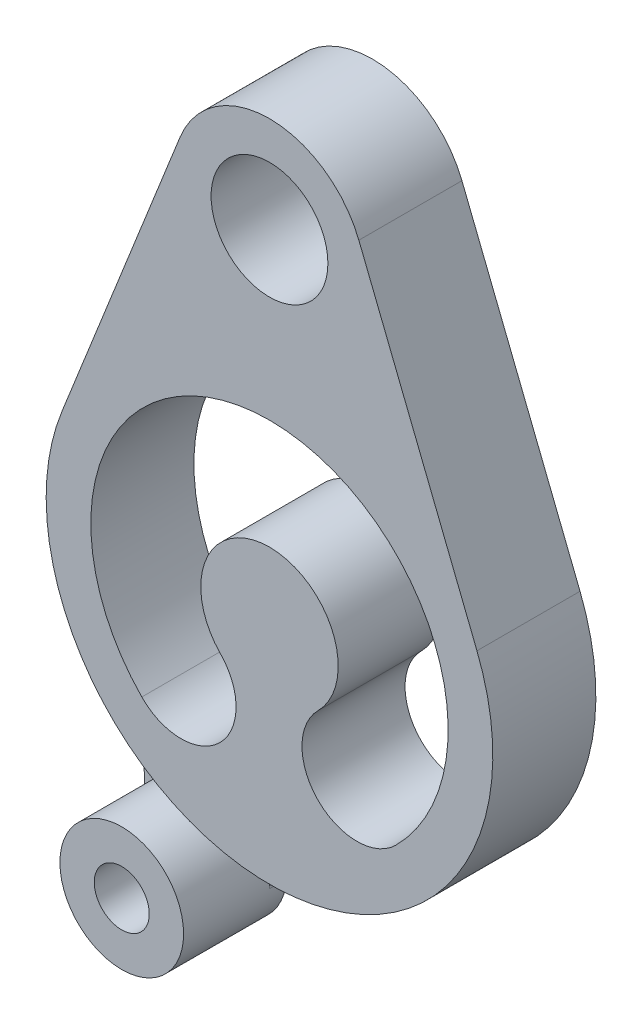
ISO-10303-21;
HEADER;
FILE_DESCRIPTION(('STEP AP214'),'2;1');
FILE_NAME('part.step','',(''),(''),'','','');
FILE_SCHEMA(('AUTOMOTIVE_DESIGN { 1 0 10303 214 1 1 1 1 }'));
ENDSEC;
DATA;
#1=APPLICATION_CONTEXT('core data for automotive mechanical design processes');
#2=APPLICATION_PROTOCOL_DEFINITION('international standard','automotive_design',2000,#1);
#3=PRODUCT_CONTEXT('',#1,'mechanical');
#4=PRODUCT('Part','Part','',(#3));
#5=PRODUCT_RELATED_PRODUCT_CATEGORY('part','',(#4));
#6=PRODUCT_DEFINITION_FORMATION('','',#4);
#7=PRODUCT_DEFINITION_CONTEXT('part definition',#1,'design');
#8=PRODUCT_DEFINITION('design','',#6,#7);
#9=PRODUCT_DEFINITION_SHAPE('','',#8);
#10=(LENGTH_UNIT() NAMED_UNIT(*) SI_UNIT(.MILLI.,.METRE.));
#11=(NAMED_UNIT(*) PLANE_ANGLE_UNIT() SI_UNIT($,.RADIAN.));
#12=(NAMED_UNIT(*) SI_UNIT($,.STERADIAN.) SOLID_ANGLE_UNIT());
#13=UNCERTAINTY_MEASURE_WITH_UNIT(LENGTH_MEASURE(1.E-05),#10,'distance_accuracy_value','');
#14=(GEOMETRIC_REPRESENTATION_CONTEXT(3) GLOBAL_UNCERTAINTY_ASSIGNED_CONTEXT((#13)) GLOBAL_UNIT_ASSIGNED_CONTEXT((#10,
#11,#12)) REPRESENTATION_CONTEXT('',''));
#15=CARTESIAN_POINT('',(0.,0.,0.));
#16=DIRECTION('',(0.,0.,1.));
#17=DIRECTION('',(1.,0.,0.));
#18=AXIS2_PLACEMENT_3D('',#15,#16,#17);
#19=CARTESIAN_POINT('',(26.0128891128994,10.36,30.));
#20=DIRECTION('',(0.929031754032121,0.37,0.));
#21=DIRECTION('',(-0.37,0.929031754032122,0.));
#22=AXIS2_PLACEMENT_3D('',#19,#20,#21);
#23=PLANE('',#22);
#24=DIRECTION('',(0.37,-0.929031754032122,0.));
#25=VECTOR('',#24,1.);
#26=CARTESIAN_POINT('',(26.0128891128994,10.36,0.));
#27=LINE('',#26,#25);
#28=CARTESIAN_POINT('',(26.0128891128994,10.36,0.));
#29=VERTEX_POINT('',#28);
#30=CARTESIAN_POINT('',(60.3870640120879,-75.95,0.));
#31=VERTEX_POINT('',#30);
#32=EDGE_CURVE('E215',#29,#31,#27,.T.);
#33=ORIENTED_EDGE('',*,*,#32,.F.);
#34=DIRECTION('',(0.,0.,-1.));
#35=VECTOR('',#34,1.);
#36=CARTESIAN_POINT('',(26.0128891128994,10.36,30.));
#37=LINE('',#36,#35);
#38=CARTESIAN_POINT('',(26.0128891128994,10.36,30.));
#39=VERTEX_POINT('',#38);
#40=EDGE_CURVE('E11',#39,#29,#37,.T.);
#41=ORIENTED_EDGE('',*,*,#40,.F.);
#42=DIRECTION('',(0.37,-0.929031754032122,0.));
#43=VECTOR('',#42,1.);
#44=CARTESIAN_POINT('',(26.0128891128994,10.36,30.));
#45=LINE('',#44,#43);
#46=CARTESIAN_POINT('',(60.3870640120879,-75.95,30.));
#47=VERTEX_POINT('',#46);
#48=EDGE_CURVE('E185',#39,#47,#45,.T.);
#49=ORIENTED_EDGE('',*,*,#48,.T.);
#50=DIRECTION('',(0.,0.,-1.));
#51=VECTOR('',#50,1.);
#52=CARTESIAN_POINT('',(60.3870640120879,-75.95,30.));
#53=LINE('',#52,#51);
#54=EDGE_CURVE('E229',#47,#31,#53,.T.);
#55=ORIENTED_EDGE('',*,*,#54,.T.);
#56=EDGE_LOOP('',(#33,#41,#49,#55));
#57=FACE_BOUND('',#56,.T.);
#58=ADVANCED_FACE('F34',(#57),#23,.T.);
#59=CARTESIAN_POINT('',(0.,0.,30.));
#60=DIRECTION('',(0.,0.,-1.));
#61=DIRECTION('',(-1.,0.,0.));
#62=AXIS2_PLACEMENT_3D('',#59,#60,#61);
#63=CYLINDRICAL_SURFACE('',#62,28.);
#64=CARTESIAN_POINT('',(0.,0.,0.));
#65=DIRECTION('',(0.,0.,1.));
#66=DIRECTION('',(1.,0.,0.));
#67=AXIS2_PLACEMENT_3D('',#64,#65,#66);
#68=CIRCLE('',#67,28.);
#69=CARTESIAN_POINT('',(-26.0128891128994,10.36,0.));
#70=VERTEX_POINT('',#69);
#71=EDGE_CURVE('E218',#29,#70,#68,.T.);
#72=ORIENTED_EDGE('',*,*,#71,.T.);
#73=DIRECTION('',(0.,0.,-1.));
#74=VECTOR('',#73,1.);
#75=CARTESIAN_POINT('',(-26.0128891128994,10.36,30.));
#76=LINE('',#75,#74);
#77=CARTESIAN_POINT('',(-26.0128891128994,10.36,30.));
#78=VERTEX_POINT('',#77);
#79=EDGE_CURVE('E43',#78,#70,#76,.T.);
#80=ORIENTED_EDGE('',*,*,#79,.F.);
#81=CARTESIAN_POINT('',(0.,0.,30.));
#82=DIRECTION('',(0.,0.,1.));
#83=DIRECTION('',(1.,0.,0.));
#84=AXIS2_PLACEMENT_3D('',#81,#82,#83);
#85=CIRCLE('',#84,28.);
#86=EDGE_CURVE('E188',#39,#78,#85,.T.);
#87=ORIENTED_EDGE('',*,*,#86,.F.);
#88=ORIENTED_EDGE('',*,*,#40,.T.);
#89=EDGE_LOOP('',(#72,#80,#87,#88));
#90=FACE_BOUND('',#89,.T.);
#91=ADVANCED_FACE('F281',(#90),#63,.T.);
#92=CARTESIAN_POINT('',(-26.0128891128994,10.36,30.));
#93=DIRECTION('',(0.929031754032121,-0.37,0.));
#94=DIRECTION('',(0.37,0.929031754032122,0.));
#95=AXIS2_PLACEMENT_3D('',#92,#93,#94);
#96=PLANE('',#95);
#97=DIRECTION('',(-0.37,-0.929031754032122,0.));
#98=VECTOR('',#97,1.);
#99=CARTESIAN_POINT('',(-26.0128891128994,10.36,0.));
#100=LINE('',#99,#98);
#101=CARTESIAN_POINT('',(-60.3870640120879,-75.95,0.));
#102=VERTEX_POINT('',#101);
#103=EDGE_CURVE('E221',#70,#102,#100,.T.);
#104=ORIENTED_EDGE('',*,*,#103,.T.);
#105=DIRECTION('',(0.,0.,-1.));
#106=VECTOR('',#105,1.);
#107=CARTESIAN_POINT('',(-60.3870640120879,-75.95,30.));
#108=LINE('',#107,#106);
#109=CARTESIAN_POINT('',(-60.3870640120879,-75.95,30.));
#110=VERTEX_POINT('',#109);
#111=EDGE_CURVE('E237',#110,#102,#108,.T.);
#112=ORIENTED_EDGE('',*,*,#111,.F.);
#113=DIRECTION('',(-0.37,-0.929031754032122,0.));
#114=VECTOR('',#113,1.);
#115=CARTESIAN_POINT('',(-26.0128891128994,10.36,30.));
#116=LINE('',#115,#114);
#117=EDGE_CURVE('E191',#78,#110,#116,.T.);
#118=ORIENTED_EDGE('',*,*,#117,.F.);
#119=ORIENTED_EDGE('',*,*,#79,.T.);
#120=EDGE_LOOP('',(#104,#112,#118,#119));
#121=FACE_BOUND('',#120,.T.);
#122=ADVANCED_FACE('F283',(#121),#96,.F.);
#123=CARTESIAN_POINT('',(0.,-100.,30.));
#124=DIRECTION('',(0.,0.,-1.));
#125=DIRECTION('',(-1.,0.,0.));
#126=AXIS2_PLACEMENT_3D('',#123,#124,#125);
#127=CYLINDRICAL_SURFACE('',#126,65.);
#128=CARTESIAN_POINT('',(0.,-100.,0.));
#129=DIRECTION('',(0.,0.,1.));
#130=DIRECTION('',(1.,0.,0.));
#131=AXIS2_PLACEMENT_3D('',#128,#129,#130);
#132=CIRCLE('',#131,65.);
#133=CARTESIAN_POINT('',(-65.,-100.,0.));
#134=VERTEX_POINT('',#133);
#135=EDGE_CURVE('E224',#102,#134,#132,.T.);
#136=ORIENTED_EDGE('',*,*,#135,.T.);
#137=DIRECTION('',(0.,0.,-1.));
#138=VECTOR('',#137,1.);
#139=CARTESIAN_POINT('',(-65.,-100.,30.));
#140=LINE('',#139,#138);
#141=CARTESIAN_POINT('',(-65.,-100.,30.));
#142=VERTEX_POINT('',#141);
#143=EDGE_CURVE('E234',#142,#134,#140,.T.);
#144=ORIENTED_EDGE('',*,*,#143,.F.);
#145=CARTESIAN_POINT('',(0.,-100.,30.));
#146=DIRECTION('',(0.,0.,1.));
#147=DIRECTION('',(1.,0.,0.));
#148=AXIS2_PLACEMENT_3D('',#145,#146,#147);
#149=CIRCLE('',#148,65.);
#150=EDGE_CURVE('E194',#110,#142,#149,.T.);
#151=ORIENTED_EDGE('',*,*,#150,.F.);
#152=ORIENTED_EDGE('',*,*,#111,.T.);
#153=EDGE_LOOP('',(#136,#144,#151,#152));
#154=FACE_BOUND('',#153,.T.);
#155=ADVANCED_FACE('F287',(#154),#127,.T.);
#156=CARTESIAN_POINT('',(-69.2892095970462,-3.06596056991683,30.));
#157=DIRECTION('',(0.999022459529505,0.0442054901072124,0.));
#158=DIRECTION('',(-0.0442054901072124,0.999022459529505,0.));
#159=AXIS2_PLACEMENT_3D('',#156,#157,#158);
#160=PLANE('',#159);
#161=DIRECTION('',(0.0442054901072124,-0.999022459529505,0.));
#162=VECTOR('',#161,1.);
#163=CARTESIAN_POINT('',(-69.2892095970462,-3.06596056991683,0.));
#164=LINE('',#163,#162);
#165=CARTESIAN_POINT('',(-64.7459637037696,-105.741096068709,0.));
#166=VERTEX_POINT('',#165);
#167=EDGE_CURVE('E227',#134,#166,#164,.T.);
#168=ORIENTED_EDGE('',*,*,#167,.T.);
#169=DIRECTION('',(0.,0.,-1.));
#170=VECTOR('',#169,1.);
#171=CARTESIAN_POINT('',(-64.7459637037696,-105.741096068709,5.));
#172=LINE('',#171,#170);
#173=CARTESIAN_POINT('',(-64.7459637037696,-105.741096068709,5.));
#174=VERTEX_POINT('',#173);
#175=EDGE_CURVE('E59',#174,#166,#172,.T.);
#176=ORIENTED_EDGE('',*,*,#175,.F.);
#177=DIRECTION('',(0.,0.,-1.));
#178=VECTOR('',#177,1.);
#179=CARTESIAN_POINT('',(-64.7459637037696,-105.741096068709,30.));
#180=LINE('',#179,#178);
#181=CARTESIAN_POINT('',(-64.7459637037696,-105.741096068709,30.));
#182=VERTEX_POINT('',#181);
#183=EDGE_CURVE('E232',#182,#174,#180,.T.);
#184=ORIENTED_EDGE('',*,*,#183,.F.);
#185=DIRECTION('',(0.0442054901072124,-0.999022459529505,0.));
#186=VECTOR('',#185,1.);
#187=CARTESIAN_POINT('',(-69.2892095970462,-3.06596056991683,30.));
#188=LINE('',#187,#186);
#189=EDGE_CURVE('E197',#142,#182,#188,.T.);
#190=ORIENTED_EDGE('',*,*,#189,.F.);
#191=ORIENTED_EDGE('',*,*,#143,.T.);
#192=EDGE_LOOP('',(#168,#176,#184,#190,#191));
#193=FACE_BOUND('',#192,.T.);
#194=ADVANCED_FACE('F288',(#193),#160,.F.);
#195=CARTESIAN_POINT('',(-25.7298452623042,-125.178861427354,30.));
#196=DIRECTION('',(0.,0.,-1.));
#197=DIRECTION('',(-1.,0.,0.));
#198=AXIS2_PLACEMENT_3D('',#195,#196,#197);
#199=CYLINDRICAL_SURFACE('',#198,16.);
#200=CARTESIAN_POINT('',(-25.7298452623042,-125.178861427354,0.));
#201=DIRECTION('',(0.,0.,1.));
#202=DIRECTION('',(1.,0.,0.));
#203=AXIS2_PLACEMENT_3D('',#200,#201,#202);
#204=CIRCLE('',#203,16.);
#205=CARTESIAN_POINT('',(-37.1653320455504,-136.369466506178,0.));
#206=VERTEX_POINT('',#205);
#207=CARTESIAN_POINT('',(-14.2943584790579,-113.98825634853,0.));
#208=VERTEX_POINT('',#207);
#209=EDGE_CURVE('E203',#206,#208,#204,.T.);
#210=ORIENTED_EDGE('',*,*,#209,.F.);
#211=DIRECTION('',(0.,0.,-1.));
#212=VECTOR('',#211,1.);
#213=CARTESIAN_POINT('',(-37.1653320455504,-136.369466506178,30.));
#214=LINE('',#213,#212);
#215=CARTESIAN_POINT('',(-37.1653320455504,-136.369466506178,30.));
#216=VERTEX_POINT('',#215);
#217=EDGE_CURVE('E38',#216,#206,#214,.T.);
#218=ORIENTED_EDGE('',*,*,#217,.F.);
#219=CARTESIAN_POINT('',(-25.7298452623042,-125.178861427354,30.));
#220=DIRECTION('',(0.,0.,1.));
#221=DIRECTION('',(1.,0.,0.));
#222=AXIS2_PLACEMENT_3D('',#219,#220,#221);
#223=CIRCLE('',#222,16.);
#224=CARTESIAN_POINT('',(-14.2943584790579,-113.98825634853,30.));
#225=VERTEX_POINT('',#224);
#226=EDGE_CURVE('E173',#216,#225,#223,.T.);
#227=ORIENTED_EDGE('',*,*,#226,.T.);
#228=DIRECTION('',(0.,0.,-1.));
#229=VECTOR('',#228,1.);
#230=CARTESIAN_POINT('',(-14.2943584790579,-113.98825634853,30.));
#231=LINE('',#230,#229);
#232=EDGE_CURVE('E242',#225,#208,#231,.T.);
#233=ORIENTED_EDGE('',*,*,#232,.T.);
#234=EDGE_LOOP('',(#210,#218,#227,#233));
#235=FACE_BOUND('',#234,.T.);
#236=ADVANCED_FACE('F255',(#235),#199,.F.);
#237=CARTESIAN_POINT('',(0.,-100.,30.));
#238=DIRECTION('',(0.,0.,-1.));
#239=DIRECTION('',(-1.,0.,0.));
#240=AXIS2_PLACEMENT_3D('',#237,#238,#239);
#241=CYLINDRICAL_SURFACE('',#240,52.);
#242=CARTESIAN_POINT('',(0.,-100.,0.));
#243=DIRECTION('',(0.,0.,1.));
#244=DIRECTION('',(1.,0.,0.));
#245=AXIS2_PLACEMENT_3D('',#242,#243,#244);
#246=CIRCLE('',#245,52.);
#247=CARTESIAN_POINT('',(36.7695526217003,-136.769552621701,0.));
#248=VERTEX_POINT('',#247);
#249=EDGE_CURVE('E206',#248,#206,#246,.T.);
#250=ORIENTED_EDGE('',*,*,#249,.F.);
#251=DIRECTION('',(0.,0.,-1.));
#252=VECTOR('',#251,1.);
#253=CARTESIAN_POINT('',(36.7695526217003,-136.769552621701,30.));
#254=LINE('',#253,#252);
#255=CARTESIAN_POINT('',(36.7695526217003,-136.769552621701,30.));
#256=VERTEX_POINT('',#255);
#257=EDGE_CURVE('E245',#256,#248,#254,.T.);
#258=ORIENTED_EDGE('',*,*,#257,.F.);
#259=CARTESIAN_POINT('',(0.,-100.,30.));
#260=DIRECTION('',(0.,0.,1.));
#261=DIRECTION('',(1.,0.,0.));
#262=AXIS2_PLACEMENT_3D('',#259,#260,#261);
#263=CIRCLE('',#262,52.);
#264=EDGE_CURVE('E177',#256,#216,#263,.T.);
#265=ORIENTED_EDGE('',*,*,#264,.T.);
#266=ORIENTED_EDGE('',*,*,#217,.T.);
#267=EDGE_LOOP('',(#250,#258,#265,#266));
#268=FACE_BOUND('',#267,.T.);
#269=ADVANCED_FACE('F251',(#268),#241,.F.);
#270=CARTESIAN_POINT('',(25.4558441227156,-125.455844122716,30.));
#271=DIRECTION('',(0.,0.,-1.));
#272=DIRECTION('',(-1.,0.,0.));
#273=AXIS2_PLACEMENT_3D('',#270,#271,#272);
#274=CYLINDRICAL_SURFACE('',#273,16.);
#275=CARTESIAN_POINT('',(25.4558441227156,-125.455844122716,0.));
#276=DIRECTION('',(0.,0.,1.));
#277=DIRECTION('',(1.,0.,0.));
#278=AXIS2_PLACEMENT_3D('',#275,#276,#277);
#279=CIRCLE('',#278,16.);
#280=CARTESIAN_POINT('',(14.1421356237309,-114.142135623731,0.));
#281=VERTEX_POINT('',#280);
#282=EDGE_CURVE('E209',#281,#248,#279,.T.);
#283=ORIENTED_EDGE('',*,*,#282,.F.);
#284=DIRECTION('',(0.,0.,-1.));
#285=VECTOR('',#284,1.);
#286=CARTESIAN_POINT('',(14.1421356237309,-114.142135623731,30.));
#287=LINE('',#286,#285);
#288=CARTESIAN_POINT('',(14.1421356237309,-114.142135623731,30.));
#289=VERTEX_POINT('',#288);
#290=EDGE_CURVE('E244',#289,#281,#287,.T.);
#291=ORIENTED_EDGE('',*,*,#290,.F.);
#292=CARTESIAN_POINT('',(25.4558441227156,-125.455844122716,30.));
#293=DIRECTION('',(0.,0.,1.));
#294=DIRECTION('',(1.,0.,0.));
#295=AXIS2_PLACEMENT_3D('',#292,#293,#294);
#296=CIRCLE('',#295,16.);
#297=EDGE_CURVE('E180',#289,#256,#296,.T.);
#298=ORIENTED_EDGE('',*,*,#297,.T.);
#299=ORIENTED_EDGE('',*,*,#257,.T.);
#300=EDGE_LOOP('',(#283,#291,#298,#299));
#301=FACE_BOUND('',#300,.T.);
#302=ADVANCED_FACE('F261',(#301),#274,.F.);
#303=CARTESIAN_POINT('',(0.,-100.,30.));
#304=DIRECTION('',(0.,0.,-1.));
#305=DIRECTION('',(-1.,0.,0.));
#306=AXIS2_PLACEMENT_3D('',#303,#304,#305);
#307=CYLINDRICAL_SURFACE('',#306,20.);
#308=CARTESIAN_POINT('',(0.,-100.,0.));
#309=DIRECTION('',(0.,0.,1.));
#310=DIRECTION('',(1.,0.,0.));
#311=AXIS2_PLACEMENT_3D('',#308,#309,#310);
#312=CIRCLE('',#311,20.);
#313=EDGE_CURVE('E212',#281,#208,#312,.T.);
#314=ORIENTED_EDGE('',*,*,#313,.T.);
#315=ORIENTED_EDGE('',*,*,#232,.F.);
#316=CARTESIAN_POINT('',(0.,-100.,30.));
#317=DIRECTION('',(0.,0.,1.));
#318=DIRECTION('',(1.,0.,0.));
#319=AXIS2_PLACEMENT_3D('',#316,#317,#318);
#320=CIRCLE('',#319,20.);
#321=EDGE_CURVE('E183',#289,#225,#320,.T.);
#322=ORIENTED_EDGE('',*,*,#321,.F.);
#323=ORIENTED_EDGE('',*,*,#290,.T.);
#324=EDGE_LOOP('',(#314,#315,#322,#323));
#325=FACE_BOUND('',#324,.T.);
#326=ADVANCED_FACE('F265',(#325),#307,.T.);
#327=CARTESIAN_POINT('',(0.,0.,30.));
#328=DIRECTION('',(0.,0.,-1.));
#329=DIRECTION('',(-1.,0.,0.));
#330=AXIS2_PLACEMENT_3D('',#327,#328,#329);
#331=CYLINDRICAL_SURFACE('',#330,17.);
#332=CARTESIAN_POINT('',(0.,0.,30.));
#333=DIRECTION('',(0.,0.,1.));
#334=DIRECTION('',(1.,0.,0.));
#335=AXIS2_PLACEMENT_3D('',#332,#333,#334);
#336=CIRCLE('',#335,17.);
#337=CARTESIAN_POINT('',(17.,0.,30.));
#338=VERTEX_POINT('',#337);
#339=EDGE_CURVE('E170',#338,#338,#336,.T.);
#340=ORIENTED_EDGE('',*,*,#339,.T.);
#341=EDGE_LOOP('',(#340));
#342=FACE_BOUND('',#341,.T.);
#343=CARTESIAN_POINT('',(0.,0.,0.));
#344=DIRECTION('',(0.,0.,1.));
#345=DIRECTION('',(1.,0.,0.));
#346=AXIS2_PLACEMENT_3D('',#343,#344,#345);
#347=CIRCLE('',#346,17.);
#348=CARTESIAN_POINT('',(17.,0.,0.));
#349=VERTEX_POINT('',#348);
#350=EDGE_CURVE('E169',#349,#349,#347,.T.);
#351=ORIENTED_EDGE('',*,*,#350,.F.);
#352=EDGE_LOOP('',(#351));
#353=FACE_BOUND('',#352,.T.);
#354=ADVANCED_FACE('F36',(#342,#353),#331,.F.);
#355=CARTESIAN_POINT('',(0.,-100.,5.));
#356=DIRECTION('',(0.,0.,1.));
#357=DIRECTION('',(1.,0.,0.));
#358=AXIS2_PLACEMENT_3D('',#355,#356,#357);
#359=CIRCLE('',#358,65.);
#360=CARTESIAN_POINT('',(2.03038556267224,-164.96828098747,5.));
#361=VERTEX_POINT('',#360);
#362=EDGE_CURVE('E51',#174,#361,#359,.T.);
#363=ORIENTED_EDGE('',*,*,#362,.T.);
#364=DIRECTION('',(0.,0.,-1.));
#365=VECTOR('',#364,1.);
#366=CARTESIAN_POINT('',(2.03038556267222,-164.96828098747,5.));
#367=LINE('',#366,#365);
#368=CARTESIAN_POINT('',(2.03038556267222,-164.96828098747,0.));
#369=VERTEX_POINT('',#368);
#370=EDGE_CURVE('E167',#361,#369,#367,.T.);
#371=ORIENTED_EDGE('',*,*,#370,.T.);
#372=EDGE_CURVE('E174',#369,#31,#132,.T.);
#373=ORIENTED_EDGE('',*,*,#372,.T.);
#374=ORIENTED_EDGE('',*,*,#54,.F.);
#375=EDGE_CURVE('E198',#182,#47,#149,.T.);
#376=ORIENTED_EDGE('',*,*,#375,.F.);
#377=ORIENTED_EDGE('',*,*,#183,.T.);
#378=EDGE_LOOP('',(#363,#371,#373,#374,#376,#377));
#379=FACE_BOUND('',#378,.T.);
#380=ADVANCED_FACE('F270',(#379),#127,.T.);
#381=CARTESIAN_POINT('',(0.,0.,30.));
#382=DIRECTION('',(0.,0.,1.));
#383=DIRECTION('',(1.,0.,0.));
#384=AXIS2_PLACEMENT_3D('',#381,#382,#383);
#385=PLANE('',#384);
#386=ORIENTED_EDGE('',*,*,#339,.F.);
#387=EDGE_LOOP('',(#386));
#388=FACE_BOUND('',#387,.T.);
#389=ORIENTED_EDGE('',*,*,#226,.F.);
#390=ORIENTED_EDGE('',*,*,#264,.F.);
#391=ORIENTED_EDGE('',*,*,#297,.F.);
#392=ORIENTED_EDGE('',*,*,#321,.T.);
#393=EDGE_LOOP('',(#389,#390,#391,#392));
#394=FACE_BOUND('',#393,.T.);
#395=ORIENTED_EDGE('',*,*,#48,.F.);
#396=ORIENTED_EDGE('',*,*,#86,.T.);
#397=ORIENTED_EDGE('',*,*,#117,.T.);
#398=ORIENTED_EDGE('',*,*,#150,.T.);
#399=ORIENTED_EDGE('',*,*,#189,.T.);
#400=ORIENTED_EDGE('',*,*,#375,.T.);
#401=EDGE_LOOP('',(#395,#396,#397,#398,#399,#400));
#402=FACE_BOUND('',#401,.T.);
#403=ADVANCED_FACE('F267',(#388,#394,#402),#385,.T.);
#404=CARTESIAN_POINT('',(0.,0.,0.));
#405=DIRECTION('',(0.,0.,1.));
#406=DIRECTION('',(1.,0.,0.));
#407=AXIS2_PLACEMENT_3D('',#404,#405,#406);
#408=PLANE('',#407);
#409=ORIENTED_EDGE('',*,*,#350,.T.);
#410=EDGE_LOOP('',(#409));
#411=FACE_BOUND('',#410,.T.);
#412=ORIENTED_EDGE('',*,*,#209,.T.);
#413=ORIENTED_EDGE('',*,*,#313,.F.);
#414=ORIENTED_EDGE('',*,*,#282,.T.);
#415=ORIENTED_EDGE('',*,*,#249,.T.);
#416=EDGE_LOOP('',(#412,#413,#414,#415));
#417=FACE_BOUND('',#416,.T.);
#418=ORIENTED_EDGE('',*,*,#32,.T.);
#419=ORIENTED_EDGE('',*,*,#372,.F.);
#420=CARTESIAN_POINT('',(2.90501318966951,-192.954617412842,0.));
#421=DIRECTION('',(0.,0.,1.));
#422=DIRECTION('',(1.,0.,0.));
#423=AXIS2_PLACEMENT_3D('',#420,#421,#422);
#424=CIRCLE('',#423,28.);
#425=CARTESIAN_POINT('',(-25.0371687518684,-191.156154639808,0.));
#426=VERTEX_POINT('',#425);
#427=EDGE_CURVE('E160',#369,#426,#424,.T.);
#428=ORIENTED_EDGE('',*,*,#427,.T.);
#429=CARTESIAN_POINT('',(-43.,-190.,0.));
#430=DIRECTION('',(0.,0.,1.));
#431=DIRECTION('',(1.,0.,0.));
#432=AXIS2_PLACEMENT_3D('',#429,#430,#431);
#433=CIRCLE('',#432,18.);
#434=CARTESIAN_POINT('',(-61.,-190.,0.));
#435=VERTEX_POINT('',#434);
#436=EDGE_CURVE('E291',#435,#426,#433,.T.);
#437=ORIENTED_EDGE('',*,*,#436,.F.);
#438=DIRECTION('',(0.0444139084444739,-0.999013215496515,0.));
#439=VECTOR('',#438,1.);
#440=CARTESIAN_POINT('',(-69.3099871716354,-3.08136807079046,0.));
#441=LINE('',#440,#439);
#442=EDGE_CURVE('E140',#166,#435,#441,.T.);
#443=ORIENTED_EDGE('',*,*,#442,.F.);
#444=ORIENTED_EDGE('',*,*,#167,.F.);
#445=ORIENTED_EDGE('',*,*,#135,.F.);
#446=ORIENTED_EDGE('',*,*,#103,.F.);
#447=ORIENTED_EDGE('',*,*,#71,.F.);
#448=EDGE_LOOP('',(#418,#419,#428,#437,#443,#444,#445,#446,#447));
#449=FACE_BOUND('',#448,.T.);
#450=CARTESIAN_POINT('',(-43.,-190.,0.));
#451=DIRECTION('',(0.,0.,1.));
#452=DIRECTION('',(1.,0.,0.));
#453=AXIS2_PLACEMENT_3D('',#450,#451,#452);
#454=CIRCLE('',#453,8.00000000000001);
#455=CARTESIAN_POINT('',(-35.,-190.,0.));
#456=VERTEX_POINT('',#455);
#457=EDGE_CURVE('E293',#456,#456,#454,.T.);
#458=ORIENTED_EDGE('',*,*,#457,.T.);
#459=EDGE_LOOP('',(#458));
#460=FACE_BOUND('',#459,.T.);
#461=ADVANCED_FACE('F259',(#411,#417,#449,#460),#408,.F.);
#462=CARTESIAN_POINT('',(2.90501318966951,-192.954617412842,5.));
#463=DIRECTION('',(0.,0.,-1.));
#464=DIRECTION('',(-1.,0.,0.));
#465=AXIS2_PLACEMENT_3D('',#462,#463,#464);
#466=CYLINDRICAL_SURFACE('',#465,28.);
#467=ORIENTED_EDGE('',*,*,#427,.F.);
#468=ORIENTED_EDGE('',*,*,#370,.F.);
#469=CARTESIAN_POINT('',(2.90501318966951,-192.954617412842,5.));
#470=DIRECTION('',(0.,0.,1.));
#471=DIRECTION('',(1.,0.,0.));
#472=AXIS2_PLACEMENT_3D('',#469,#470,#471);
#473=CIRCLE('',#472,28.);
#474=CARTESIAN_POINT('',(-25.0371687518684,-191.156154639808,5.));
#475=VERTEX_POINT('',#474);
#476=EDGE_CURVE('E164',#361,#475,#473,.T.);
#477=ORIENTED_EDGE('',*,*,#476,.T.);
#478=DIRECTION('',(0.,0.,-1.));
#479=VECTOR('',#478,1.);
#480=CARTESIAN_POINT('',(-25.0371687518684,-191.156154639808,5.));
#481=LINE('',#480,#479);
#482=EDGE_CURVE('E145',#475,#426,#481,.T.);
#483=ORIENTED_EDGE('',*,*,#482,.T.);
#484=EDGE_LOOP('',(#467,#468,#477,#483));
#485=FACE_BOUND('',#484,.T.);
#486=ADVANCED_FACE('F302',(#485),#466,.F.);
#487=CARTESIAN_POINT('',(-69.3099871716354,-3.08136807079046,5.));
#488=DIRECTION('',(0.999013215496515,0.0444139084444739,0.));
#489=DIRECTION('',(-0.0444139084444739,0.999013215496515,0.));
#490=AXIS2_PLACEMENT_3D('',#487,#488,#489);
#491=PLANE('',#490);
#492=ORIENTED_EDGE('',*,*,#442,.T.);
#493=DIRECTION('',(0.,0.,-1.));
#494=VECTOR('',#493,1.);
#495=CARTESIAN_POINT('',(-61.,-190.,5.));
#496=LINE('',#495,#494);
#497=CARTESIAN_POINT('',(-61.,-190.,5.));
#498=VERTEX_POINT('',#497);
#499=EDGE_CURVE('E135',#498,#435,#496,.T.);
#500=ORIENTED_EDGE('',*,*,#499,.F.);
#501=DIRECTION('',(0.0444139084444739,-0.999013215496515,0.));
#502=VECTOR('',#501,1.);
#503=CARTESIAN_POINT('',(-69.3099871716354,-3.08136807079046,5.));
#504=LINE('',#503,#502);
#505=EDGE_CURVE('E138',#174,#498,#504,.T.);
#506=ORIENTED_EDGE('',*,*,#505,.F.);
#507=ORIENTED_EDGE('',*,*,#175,.T.);
#508=EDGE_LOOP('',(#492,#500,#506,#507));
#509=FACE_BOUND('',#508,.T.);
#510=ADVANCED_FACE('F137',(#509),#491,.F.);
#511=CARTESIAN_POINT('',(0.,0.,5.));
#512=DIRECTION('',(0.,0.,1.));
#513=DIRECTION('',(1.,0.,0.));
#514=AXIS2_PLACEMENT_3D('',#511,#512,#513);
#515=PLANE('',#514);
#516=ORIENTED_EDGE('',*,*,#476,.F.);
#517=ORIENTED_EDGE('',*,*,#362,.F.);
#518=ORIENTED_EDGE('',*,*,#505,.T.);
#519=CARTESIAN_POINT('',(-43.,-190.,5.));
#520=DIRECTION('',(0.,0.,1.));
#521=DIRECTION('',(1.,0.,0.));
#522=AXIS2_PLACEMENT_3D('',#519,#520,#521);
#523=CIRCLE('',#522,18.);
#524=EDGE_CURVE('E151',#475,#498,#523,.T.);
#525=ORIENTED_EDGE('',*,*,#524,.F.);
#526=EDGE_LOOP('',(#516,#517,#518,#525));
#527=FACE_BOUND('',#526,.T.);
#528=ADVANCED_FACE('F150',(#527),#515,.T.);
#529=CARTESIAN_POINT('',(-43.,-190.,30.));
#530=DIRECTION('',(0.,0.,-1.));
#531=DIRECTION('',(-1.,0.,0.));
#532=AXIS2_PLACEMENT_3D('',#529,#530,#531);
#533=CYLINDRICAL_SURFACE('',#532,8.00000000000001);
#534=CARTESIAN_POINT('',(-43.,-190.,30.));
#535=DIRECTION('',(0.,0.,1.));
#536=DIRECTION('',(1.,0.,0.));
#537=AXIS2_PLACEMENT_3D('',#534,#535,#536);
#538=CIRCLE('',#537,8.00000000000001);
#539=CARTESIAN_POINT('',(-35.,-190.,30.));
#540=VERTEX_POINT('',#539);
#541=EDGE_CURVE('E292',#540,#540,#538,.T.);
#542=ORIENTED_EDGE('',*,*,#541,.T.);
#543=EDGE_LOOP('',(#542));
#544=FACE_BOUND('',#543,.T.);
#545=ORIENTED_EDGE('',*,*,#457,.F.);
#546=EDGE_LOOP('',(#545));
#547=FACE_BOUND('',#546,.T.);
#548=ADVANCED_FACE('F417',(#544,#547),#533,.F.);
#549=CARTESIAN_POINT('',(-43.,-190.,30.));
#550=DIRECTION('',(0.,0.,-1.));
#551=DIRECTION('',(-1.,0.,0.));
#552=AXIS2_PLACEMENT_3D('',#549,#550,#551);
#553=CYLINDRICAL_SURFACE('',#552,18.);
#554=ORIENTED_EDGE('',*,*,#482,.F.);
#555=ORIENTED_EDGE('',*,*,#524,.T.);
#556=ORIENTED_EDGE('',*,*,#499,.T.);
#557=ORIENTED_EDGE('',*,*,#436,.T.);
#558=EDGE_LOOP('',(#554,#555,#556,#557));
#559=FACE_BOUND('',#558,.T.);
#560=CARTESIAN_POINT('',(-43.,-190.,30.));
#561=DIRECTION('',(0.,0.,1.));
#562=DIRECTION('',(1.,0.,0.));
#563=AXIS2_PLACEMENT_3D('',#560,#561,#562);
#564=CIRCLE('',#563,18.);
#565=CARTESIAN_POINT('',(-25.,-190.,30.));
#566=VERTEX_POINT('',#565);
#567=EDGE_CURVE('E163',#566,#566,#564,.T.);
#568=ORIENTED_EDGE('',*,*,#567,.F.);
#569=EDGE_LOOP('',(#568));
#570=FACE_BOUND('',#569,.T.);
#571=ADVANCED_FACE('F154',(#559,#570),#553,.T.);
#572=CARTESIAN_POINT('',(0.,0.,30.));
#573=DIRECTION('',(0.,0.,1.));
#574=DIRECTION('',(1.,0.,0.));
#575=AXIS2_PLACEMENT_3D('',#572,#573,#574);
#576=PLANE('',#575);
#577=ORIENTED_EDGE('',*,*,#541,.F.);
#578=EDGE_LOOP('',(#577));
#579=FACE_BOUND('',#578,.T.);
#580=ORIENTED_EDGE('',*,*,#567,.T.);
#581=EDGE_LOOP('',(#580));
#582=FACE_BOUND('',#581,.T.);
#583=ADVANCED_FACE('F435',(#579,#582),#576,.T.);
#584=CLOSED_SHELL('',(#58,#91,#122,#155,#194,#236,#269,#302,#326,#354,#380,#403,#461,#486,#510,
#528,#548,#571,#583));
#585=MANIFOLD_SOLID_BREP('B2',#584);
#586=ADVANCED_BREP_SHAPE_REPRESENTATION('',(#18,#585),#14);
#587=SHAPE_DEFINITION_REPRESENTATION(#9,#586);
ENDSEC;
END-ISO-10303-21;
